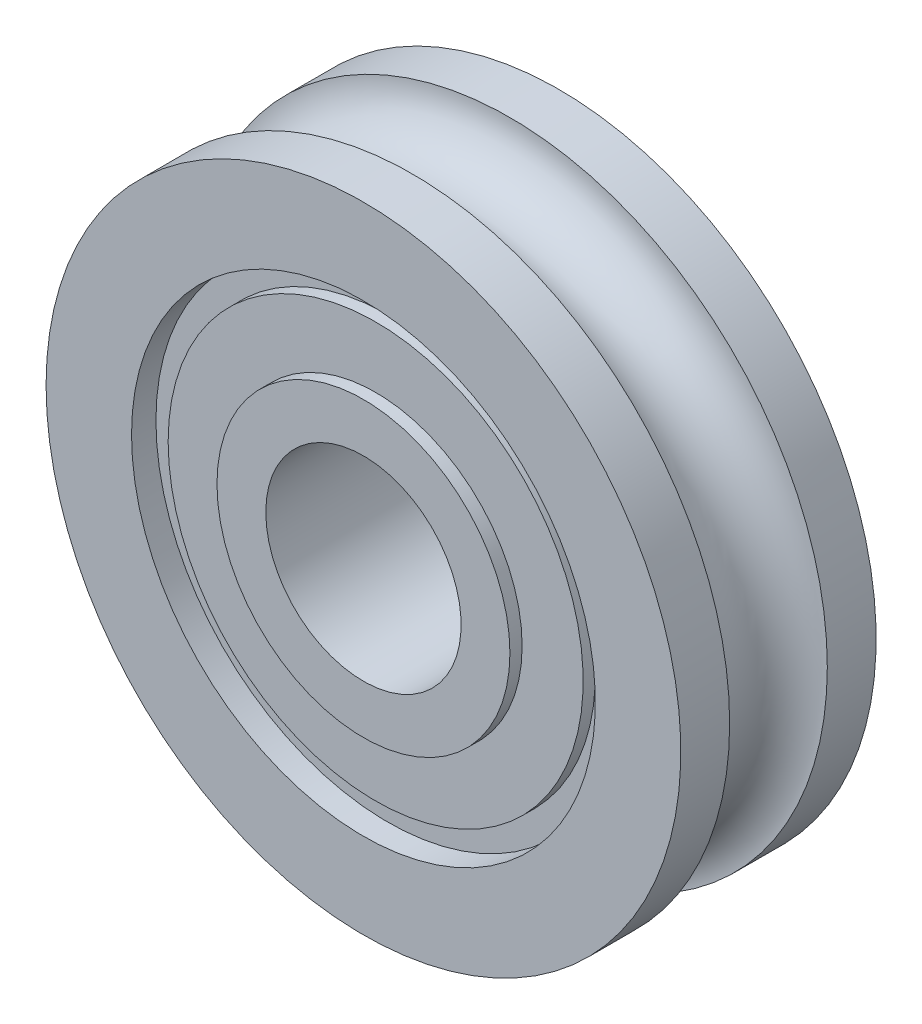
ISO-10303-21;
HEADER;
FILE_DESCRIPTION(('STEP AP214'),'2;1');
FILE_NAME('part.step','',(''),(''),'','','');
FILE_SCHEMA(('AUTOMOTIVE_DESIGN { 1 0 10303 214 1 1 1 1 }'));
ENDSEC;
DATA;
#1=APPLICATION_CONTEXT('core data for automotive mechanical design processes');
#2=APPLICATION_PROTOCOL_DEFINITION('international standard','automotive_design',2000,#1);
#3=PRODUCT_CONTEXT('',#1,'mechanical');
#4=PRODUCT('Part','Part','',(#3));
#5=PRODUCT_RELATED_PRODUCT_CATEGORY('part','',(#4));
#6=PRODUCT_DEFINITION_FORMATION('','',#4);
#7=PRODUCT_DEFINITION_CONTEXT('part definition',#1,'design');
#8=PRODUCT_DEFINITION('design','',#6,#7);
#9=PRODUCT_DEFINITION_SHAPE('','',#8);
#10=(LENGTH_UNIT() NAMED_UNIT(*) SI_UNIT(.MILLI.,.METRE.));
#11=(NAMED_UNIT(*) PLANE_ANGLE_UNIT() SI_UNIT($,.RADIAN.));
#12=(NAMED_UNIT(*) SI_UNIT($,.STERADIAN.) SOLID_ANGLE_UNIT());
#13=UNCERTAINTY_MEASURE_WITH_UNIT(LENGTH_MEASURE(1.E-05),#10,'distance_accuracy_value','');
#14=(GEOMETRIC_REPRESENTATION_CONTEXT(3) GLOBAL_UNCERTAINTY_ASSIGNED_CONTEXT((#13)) GLOBAL_UNIT_ASSIGNED_CONTEXT((#10,
#11,#12)) REPRESENTATION_CONTEXT('',''));
#15=CARTESIAN_POINT('',(0.,0.,0.));
#16=DIRECTION('',(0.,0.,1.));
#17=DIRECTION('',(1.,0.,0.));
#18=AXIS2_PLACEMENT_3D('',#15,#16,#17);
#19=CARTESIAN_POINT('',(0.,0.,2.));
#20=DIRECTION('',(0.,0.,1.));
#21=DIRECTION('',(1.,0.,0.));
#22=AXIS2_PLACEMENT_3D('',#19,#20,#21);
#23=PLANE('',#22);
#24=CARTESIAN_POINT('',(0.,0.,2.));
#25=DIRECTION('',(0.,0.,-1.));
#26=DIRECTION('',(1.,0.,0.));
#27=AXIS2_PLACEMENT_3D('',#24,#25,#26);
#28=CIRCLE('',#27,4.75);
#29=CARTESIAN_POINT('',(-4.75,0.,2.));
#30=VERTEX_POINT('',#29);
#31=EDGE_CURVE('E150',#30,#30,#28,.T.);
#32=ORIENTED_EDGE('',*,*,#31,.T.);
#33=EDGE_LOOP('',(#32));
#34=FACE_BOUND('',#33,.T.);
#35=CARTESIAN_POINT('',(0.,0.,2.));
#36=DIRECTION('',(0.,0.,1.));
#37=DIRECTION('',(1.,0.,0.));
#38=AXIS2_PLACEMENT_3D('',#35,#36,#37);
#39=CIRCLE('',#38,6.5);
#40=CARTESIAN_POINT('',(-6.5,0.,2.));
#41=VERTEX_POINT('',#40);
#42=EDGE_CURVE('E24',#41,#41,#39,.T.);
#43=ORIENTED_EDGE('',*,*,#42,.T.);
#44=EDGE_LOOP('',(#43));
#45=FACE_BOUND('',#44,.T.);
#46=ADVANCED_FACE('F16',(#34,#45),#23,.T.);
#47=CARTESIAN_POINT('',(0.,0.,0.));
#48=DIRECTION('',(0.,0.,1.));
#49=DIRECTION('',(1.,0.,0.));
#50=AXIS2_PLACEMENT_3D('',#47,#48,#49);
#51=CYLINDRICAL_SURFACE('',#50,6.5);
#52=ORIENTED_EDGE('',*,*,#42,.F.);
#53=DIRECTION('',(0.,0.,-1.));
#54=VECTOR('',#53,1.);
#55=CARTESIAN_POINT('',(-6.5,0.,0.));
#56=LINE('',#55,#54);
#57=CARTESIAN_POINT('',(-6.5,0.,1.));
#58=VERTEX_POINT('',#57);
#59=EDGE_CURVE('E11',#41,#58,#56,.T.);
#60=ORIENTED_EDGE('',*,*,#59,.T.);
#61=CARTESIAN_POINT('',(0.,0.,1.));
#62=DIRECTION('',(0.,0.,1.));
#63=DIRECTION('',(1.,0.,0.));
#64=AXIS2_PLACEMENT_3D('',#61,#62,#63);
#65=CIRCLE('',#64,6.5);
#66=CARTESIAN_POINT('',(6.5,0.,1.));
#67=VERTEX_POINT('',#66);
#68=EDGE_CURVE('E167',#58,#67,#65,.T.);
#69=ORIENTED_EDGE('',*,*,#68,.T.);
#70=CARTESIAN_POINT('',(0.,0.,1.));
#71=DIRECTION('',(0.,0.,1.));
#72=DIRECTION('',(1.,0.,0.));
#73=AXIS2_PLACEMENT_3D('',#70,#71,#72);
#74=CIRCLE('',#73,6.5);
#75=EDGE_CURVE('E169',#67,#58,#74,.T.);
#76=ORIENTED_EDGE('',*,*,#75,.T.);
#77=ORIENTED_EDGE('',*,*,#59,.F.);
#78=EDGE_LOOP('',(#52,#60,#69,#76,#77));
#79=FACE_BOUND('',#78,.T.);
#80=ADVANCED_FACE('F164',(#79),#51,.T.);
#81=CARTESIAN_POINT('',(0.,0.,0.));
#82=DIRECTION('',(0.,0.,1.));
#83=DIRECTION('',(1.,0.,0.));
#84=AXIS2_PLACEMENT_3D('',#81,#82,#83);
#85=CYLINDRICAL_SURFACE('',#84,4.75);
#86=CARTESIAN_POINT('',(0.,0.,-1.5));
#87=DIRECTION('',(0.,0.,1.));
#88=DIRECTION('',(1.,0.,0.));
#89=AXIS2_PLACEMENT_3D('',#86,#87,#88);
#90=CIRCLE('',#89,4.75);
#91=CARTESIAN_POINT('',(-4.75,0.,-1.5));
#92=VERTEX_POINT('',#91);
#93=EDGE_CURVE('E200',#92,#92,#90,.T.);
#94=ORIENTED_EDGE('',*,*,#93,.T.);
#95=DIRECTION('',(0.,0.,-1.));
#96=VECTOR('',#95,1.);
#97=CARTESIAN_POINT('',(-4.75,0.,0.));
#98=LINE('',#97,#96);
#99=CARTESIAN_POINT('',(-4.75,0.,-2.));
#100=VERTEX_POINT('',#99);
#101=EDGE_CURVE('E44',#92,#100,#98,.T.);
#102=ORIENTED_EDGE('',*,*,#101,.T.);
#103=CARTESIAN_POINT('',(0.,0.,-2.));
#104=DIRECTION('',(0.,0.,1.));
#105=DIRECTION('',(1.,0.,0.));
#106=AXIS2_PLACEMENT_3D('',#103,#104,#105);
#107=CIRCLE('',#106,4.75);
#108=EDGE_CURVE('E157',#100,#100,#107,.T.);
#109=ORIENTED_EDGE('',*,*,#108,.F.);
#110=ORIENTED_EDGE('',*,*,#101,.F.);
#111=EDGE_LOOP('',(#94,#102,#109,#110));
#112=FACE_BOUND('',#111,.T.);
#113=ADVANCED_FACE('F256',(#112),#85,.F.);
#114=CARTESIAN_POINT('',(0.,0.,-2.));
#115=DIRECTION('',(0.,0.,1.));
#116=DIRECTION('',(1.,0.,0.));
#117=AXIS2_PLACEMENT_3D('',#114,#115,#116);
#118=PLANE('',#117);
#119=ORIENTED_EDGE('',*,*,#108,.T.);
#120=EDGE_LOOP('',(#119));
#121=FACE_BOUND('',#120,.T.);
#122=CARTESIAN_POINT('',(0.,0.,-2.));
#123=DIRECTION('',(0.,0.,-1.));
#124=DIRECTION('',(1.,0.,0.));
#125=AXIS2_PLACEMENT_3D('',#122,#123,#124);
#126=CIRCLE('',#125,6.5);
#127=CARTESIAN_POINT('',(-6.5,0.,-2.));
#128=VERTEX_POINT('',#127);
#129=EDGE_CURVE('E198',#128,#128,#126,.T.);
#130=ORIENTED_EDGE('',*,*,#129,.T.);
#131=EDGE_LOOP('',(#130));
#132=FACE_BOUND('',#131,.T.);
#133=ADVANCED_FACE('F260',(#121,#132),#118,.F.);
#134=CARTESIAN_POINT('',(0.,0.,0.));
#135=DIRECTION('',(0.,0.,1.));
#136=DIRECTION('',(1.,0.,0.));
#137=AXIS2_PLACEMENT_3D('',#134,#135,#136);
#138=CYLINDRICAL_SURFACE('',#137,4.75);
#139=ORIENTED_EDGE('',*,*,#31,.F.);
#140=DIRECTION('',(0.,0.,-1.));
#141=VECTOR('',#140,1.);
#142=CARTESIAN_POINT('',(-4.75,0.,0.));
#143=LINE('',#142,#141);
#144=CARTESIAN_POINT('',(-4.75,0.,1.5));
#145=VERTEX_POINT('',#144);
#146=EDGE_CURVE('E154',#30,#145,#143,.T.);
#147=ORIENTED_EDGE('',*,*,#146,.T.);
#148=CARTESIAN_POINT('',(0.,0.,1.5));
#149=DIRECTION('',(0.,0.,-1.));
#150=DIRECTION('',(1.,0.,0.));
#151=AXIS2_PLACEMENT_3D('',#148,#149,#150);
#152=CIRCLE('',#151,4.75);
#153=EDGE_CURVE('E186',#145,#145,#152,.T.);
#154=ORIENTED_EDGE('',*,*,#153,.T.);
#155=ORIENTED_EDGE('',*,*,#146,.F.);
#156=EDGE_LOOP('',(#139,#147,#154,#155));
#157=FACE_BOUND('',#156,.T.);
#158=ADVANCED_FACE('F249',(#157),#138,.F.);
#159=CARTESIAN_POINT('',(0.,0.,2.));
#160=DIRECTION('',(0.,0.,1.));
#161=DIRECTION('',(1.,0.,0.));
#162=AXIS2_PLACEMENT_3D('',#159,#160,#161);
#163=PLANE('',#162);
#164=CARTESIAN_POINT('',(0.,0.,2.));
#165=DIRECTION('',(0.,0.,-1.));
#166=DIRECTION('',(1.,0.,0.));
#167=AXIS2_PLACEMENT_3D('',#164,#165,#166);
#168=CIRCLE('',#167,2.);
#169=CARTESIAN_POINT('',(-2.,0.,2.));
#170=VERTEX_POINT('',#169);
#171=EDGE_CURVE('E140',#170,#170,#168,.T.);
#172=ORIENTED_EDGE('',*,*,#171,.T.);
#173=EDGE_LOOP('',(#172));
#174=FACE_BOUND('',#173,.T.);
#175=CARTESIAN_POINT('',(0.,0.,2.));
#176=DIRECTION('',(0.,0.,1.));
#177=DIRECTION('',(1.,0.,0.));
#178=AXIS2_PLACEMENT_3D('',#175,#176,#177);
#179=CIRCLE('',#178,3.);
#180=CARTESIAN_POINT('',(-3.,0.,2.));
#181=VERTEX_POINT('',#180);
#182=EDGE_CURVE('E124',#181,#181,#179,.T.);
#183=ORIENTED_EDGE('',*,*,#182,.T.);
#184=EDGE_LOOP('',(#183));
#185=FACE_BOUND('',#184,.T.);
#186=ADVANCED_FACE('F268',(#174,#185),#163,.T.);
#187=CARTESIAN_POINT('',(0.,0.,0.));
#188=DIRECTION('',(0.,0.,1.));
#189=DIRECTION('',(1.,0.,0.));
#190=AXIS2_PLACEMENT_3D('',#187,#188,#189);
#191=CYLINDRICAL_SURFACE('',#190,3.);
#192=CARTESIAN_POINT('',(0.,0.,-1.75));
#193=DIRECTION('',(0.,0.,-1.));
#194=DIRECTION('',(1.,0.,0.));
#195=AXIS2_PLACEMENT_3D('',#192,#193,#194);
#196=CIRCLE('',#195,3.);
#197=CARTESIAN_POINT('',(-3.,0.,-1.75));
#198=VERTEX_POINT('',#197);
#199=EDGE_CURVE('E210',#198,#198,#196,.T.);
#200=ORIENTED_EDGE('',*,*,#199,.T.);
#201=DIRECTION('',(0.,0.,-1.));
#202=VECTOR('',#201,1.);
#203=CARTESIAN_POINT('',(-3.,0.,0.));
#204=LINE('',#203,#202);
#205=CARTESIAN_POINT('',(-3.,0.,-2.));
#206=VERTEX_POINT('',#205);
#207=EDGE_CURVE('E147',#198,#206,#204,.T.);
#208=ORIENTED_EDGE('',*,*,#207,.T.);
#209=CARTESIAN_POINT('',(0.,0.,-2.));
#210=DIRECTION('',(0.,0.,-1.));
#211=DIRECTION('',(1.,0.,0.));
#212=AXIS2_PLACEMENT_3D('',#209,#210,#211);
#213=CIRCLE('',#212,3.);
#214=EDGE_CURVE('E126',#206,#206,#213,.T.);
#215=ORIENTED_EDGE('',*,*,#214,.F.);
#216=ORIENTED_EDGE('',*,*,#207,.F.);
#217=EDGE_LOOP('',(#200,#208,#215,#216));
#218=FACE_BOUND('',#217,.T.);
#219=ADVANCED_FACE('F273',(#218),#191,.T.);
#220=CARTESIAN_POINT('',(0.,0.,0.));
#221=DIRECTION('',(0.,0.,1.));
#222=DIRECTION('',(1.,0.,0.));
#223=AXIS2_PLACEMENT_3D('',#220,#221,#222);
#224=CYLINDRICAL_SURFACE('',#223,2.);
#225=ORIENTED_EDGE('',*,*,#171,.F.);
#226=DIRECTION('',(0.,0.,-1.));
#227=VECTOR('',#226,1.);
#228=CARTESIAN_POINT('',(-2.,0.,0.));
#229=LINE('',#228,#227);
#230=CARTESIAN_POINT('',(-2.,0.,-2.));
#231=VERTEX_POINT('',#230);
#232=EDGE_CURVE('E144',#170,#231,#229,.T.);
#233=ORIENTED_EDGE('',*,*,#232,.T.);
#234=CARTESIAN_POINT('',(0.,0.,-2.));
#235=DIRECTION('',(0.,0.,1.));
#236=DIRECTION('',(1.,0.,0.));
#237=AXIS2_PLACEMENT_3D('',#234,#235,#236);
#238=CIRCLE('',#237,2.);
#239=EDGE_CURVE('E133',#231,#231,#238,.T.);
#240=ORIENTED_EDGE('',*,*,#239,.F.);
#241=ORIENTED_EDGE('',*,*,#232,.F.);
#242=EDGE_LOOP('',(#225,#233,#240,#241));
#243=FACE_BOUND('',#242,.T.);
#244=ADVANCED_FACE('F276',(#243),#224,.F.);
#245=CARTESIAN_POINT('',(0.,0.,-2.));
#246=DIRECTION('',(0.,0.,1.));
#247=DIRECTION('',(1.,0.,0.));
#248=AXIS2_PLACEMENT_3D('',#245,#246,#247);
#249=PLANE('',#248);
#250=ORIENTED_EDGE('',*,*,#239,.T.);
#251=EDGE_LOOP('',(#250));
#252=FACE_BOUND('',#251,.T.);
#253=ORIENTED_EDGE('',*,*,#214,.T.);
#254=EDGE_LOOP('',(#253));
#255=FACE_BOUND('',#254,.T.);
#256=ADVANCED_FACE('F283',(#252,#255),#249,.F.);
#257=CARTESIAN_POINT('',(0.,0.,0.));
#258=DIRECTION('',(0.,0.,1.));
#259=DIRECTION('',(1.,0.,0.));
#260=AXIS2_PLACEMENT_3D('',#257,#258,#259);
#261=CYLINDRICAL_SURFACE('',#260,3.);
#262=ORIENTED_EDGE('',*,*,#182,.F.);
#263=DIRECTION('',(0.,0.,-1.));
#264=VECTOR('',#263,1.);
#265=CARTESIAN_POINT('',(-3.,0.,0.));
#266=LINE('',#265,#264);
#267=CARTESIAN_POINT('',(-3.,0.,1.75));
#268=VERTEX_POINT('',#267);
#269=EDGE_CURVE('E119',#181,#268,#266,.T.);
#270=ORIENTED_EDGE('',*,*,#269,.T.);
#271=CARTESIAN_POINT('',(0.,0.,1.75));
#272=DIRECTION('',(0.,0.,1.));
#273=DIRECTION('',(1.,0.,0.));
#274=AXIS2_PLACEMENT_3D('',#271,#272,#273);
#275=CIRCLE('',#274,3.);
#276=EDGE_CURVE('E122',#268,#268,#275,.T.);
#277=ORIENTED_EDGE('',*,*,#276,.T.);
#278=ORIENTED_EDGE('',*,*,#269,.F.);
#279=EDGE_LOOP('',(#262,#270,#277,#278));
#280=FACE_BOUND('',#279,.T.);
#281=ADVANCED_FACE('F120',(#280),#261,.T.);
#282=CARTESIAN_POINT('',(0.,0.,1.75));
#283=DIRECTION('',(0.,0.,1.));
#284=DIRECTION('',(1.,0.,0.));
#285=AXIS2_PLACEMENT_3D('',#282,#283,#284);
#286=PLANE('',#285);
#287=ORIENTED_EDGE('',*,*,#276,.F.);
#288=EDGE_LOOP('',(#287));
#289=FACE_BOUND('',#288,.T.);
#290=CARTESIAN_POINT('',(0.,0.,1.75));
#291=DIRECTION('',(0.,0.,1.));
#292=DIRECTION('',(1.,0.,0.));
#293=AXIS2_PLACEMENT_3D('',#290,#291,#292);
#294=CIRCLE('',#293,4.25);
#295=CARTESIAN_POINT('',(-4.25,0.,1.75));
#296=VERTEX_POINT('',#295);
#297=EDGE_CURVE('E195',#296,#296,#294,.T.);
#298=ORIENTED_EDGE('',*,*,#297,.T.);
#299=EDGE_LOOP('',(#298));
#300=FACE_BOUND('',#299,.T.);
#301=ADVANCED_FACE('F236',(#289,#300),#286,.T.);
#302=CARTESIAN_POINT('',(0.,0.,0.));
#303=DIRECTION('',(0.,0.,1.));
#304=DIRECTION('',(1.,0.,0.));
#305=AXIS2_PLACEMENT_3D('',#302,#303,#304);
#306=CYLINDRICAL_SURFACE('',#305,4.25);
#307=CARTESIAN_POINT('',(0.,0.,-1.5));
#308=DIRECTION('',(0.,0.,-1.));
#309=DIRECTION('',(1.,0.,0.));
#310=AXIS2_PLACEMENT_3D('',#307,#308,#309);
#311=CIRCLE('',#310,4.25);
#312=CARTESIAN_POINT('',(-4.25,0.,-1.5));
#313=VERTEX_POINT('',#312);
#314=EDGE_CURVE('E191',#313,#313,#311,.T.);
#315=ORIENTED_EDGE('',*,*,#314,.T.);
#316=DIRECTION('',(0.,0.,-1.));
#317=VECTOR('',#316,1.);
#318=CARTESIAN_POINT('',(-4.25,0.,0.));
#319=LINE('',#318,#317);
#320=CARTESIAN_POINT('',(-4.25,0.,-1.75));
#321=VERTEX_POINT('',#320);
#322=EDGE_CURVE('E213',#313,#321,#319,.T.);
#323=ORIENTED_EDGE('',*,*,#322,.T.);
#324=CARTESIAN_POINT('',(0.,0.,-1.75));
#325=DIRECTION('',(0.,0.,-1.));
#326=DIRECTION('',(1.,0.,0.));
#327=AXIS2_PLACEMENT_3D('',#324,#325,#326);
#328=CIRCLE('',#327,4.25);
#329=EDGE_CURVE('E206',#321,#321,#328,.T.);
#330=ORIENTED_EDGE('',*,*,#329,.F.);
#331=ORIENTED_EDGE('',*,*,#322,.F.);
#332=EDGE_LOOP('',(#315,#323,#330,#331));
#333=FACE_BOUND('',#332,.T.);
#334=ADVANCED_FACE('F271',(#333),#306,.T.);
#335=CARTESIAN_POINT('',(0.,0.,-1.75));
#336=DIRECTION('',(0.,0.,1.));
#337=DIRECTION('',(1.,0.,0.));
#338=AXIS2_PLACEMENT_3D('',#335,#336,#337);
#339=PLANE('',#338);
#340=ORIENTED_EDGE('',*,*,#199,.F.);
#341=EDGE_LOOP('',(#340));
#342=FACE_BOUND('',#341,.T.);
#343=ORIENTED_EDGE('',*,*,#329,.T.);
#344=EDGE_LOOP('',(#343));
#345=FACE_BOUND('',#344,.T.);
#346=ADVANCED_FACE('F280',(#342,#345),#339,.F.);
#347=CARTESIAN_POINT('',(0.,0.,0.));
#348=DIRECTION('',(0.,0.,1.));
#349=DIRECTION('',(1.,0.,0.));
#350=AXIS2_PLACEMENT_3D('',#347,#348,#349);
#351=CYLINDRICAL_SURFACE('',#350,4.25);
#352=ORIENTED_EDGE('',*,*,#297,.F.);
#353=DIRECTION('',(0.,0.,-1.));
#354=VECTOR('',#353,1.);
#355=CARTESIAN_POINT('',(-4.25,0.,0.));
#356=LINE('',#355,#354);
#357=CARTESIAN_POINT('',(-4.25,0.,1.5));
#358=VERTEX_POINT('',#357);
#359=EDGE_CURVE('E203',#296,#358,#356,.T.);
#360=ORIENTED_EDGE('',*,*,#359,.T.);
#361=CARTESIAN_POINT('',(0.,0.,1.5));
#362=DIRECTION('',(0.,0.,1.));
#363=DIRECTION('',(1.,0.,0.));
#364=AXIS2_PLACEMENT_3D('',#361,#362,#363);
#365=CIRCLE('',#364,4.25);
#366=EDGE_CURVE('E190',#358,#358,#365,.T.);
#367=ORIENTED_EDGE('',*,*,#366,.T.);
#368=ORIENTED_EDGE('',*,*,#359,.F.);
#369=EDGE_LOOP('',(#352,#360,#367,#368));
#370=FACE_BOUND('',#369,.T.);
#371=ADVANCED_FACE('F238',(#370),#351,.T.);
#372=CARTESIAN_POINT('',(0.,0.,1.5));
#373=DIRECTION('',(0.,0.,1.));
#374=DIRECTION('',(1.,0.,0.));
#375=AXIS2_PLACEMENT_3D('',#372,#373,#374);
#376=PLANE('',#375);
#377=ORIENTED_EDGE('',*,*,#366,.F.);
#378=EDGE_LOOP('',(#377));
#379=FACE_BOUND('',#378,.T.);
#380=ORIENTED_EDGE('',*,*,#153,.F.);
#381=EDGE_LOOP('',(#380));
#382=FACE_BOUND('',#381,.T.);
#383=ADVANCED_FACE('F241',(#379,#382),#376,.T.);
#384=CARTESIAN_POINT('',(0.,0.,-1.5));
#385=DIRECTION('',(0.,0.,1.));
#386=DIRECTION('',(1.,0.,0.));
#387=AXIS2_PLACEMENT_3D('',#384,#385,#386);
#388=PLANE('',#387);
#389=ORIENTED_EDGE('',*,*,#314,.F.);
#390=EDGE_LOOP('',(#389));
#391=FACE_BOUND('',#390,.T.);
#392=ORIENTED_EDGE('',*,*,#93,.F.);
#393=EDGE_LOOP('',(#392));
#394=FACE_BOUND('',#393,.T.);
#395=ADVANCED_FACE('F244',(#391,#394),#388,.F.);
#396=CARTESIAN_POINT('',(0.,0.,0.));
#397=DIRECTION('',(0.,0.,1.));
#398=DIRECTION('',(1.,0.,0.));
#399=AXIS2_PLACEMENT_3D('',#396,#397,#398);
#400=CYLINDRICAL_SURFACE('',#399,6.5);
#401=CARTESIAN_POINT('',(0.,0.,-1.));
#402=DIRECTION('',(0.,0.,-1.));
#403=DIRECTION('',(1.,0.,0.));
#404=AXIS2_PLACEMENT_3D('',#401,#402,#403);
#405=CIRCLE('',#404,6.5);
#406=CARTESIAN_POINT('',(-6.5,0.,-1.));
#407=VERTEX_POINT('',#406);
#408=CARTESIAN_POINT('',(6.5,0.,-1.));
#409=VERTEX_POINT('',#408);
#410=EDGE_CURVE('E226',#407,#409,#405,.T.);
#411=ORIENTED_EDGE('',*,*,#410,.T.);
#412=CARTESIAN_POINT('',(0.,0.,-1.));
#413=DIRECTION('',(0.,0.,-1.));
#414=DIRECTION('',(1.,0.,0.));
#415=AXIS2_PLACEMENT_3D('',#412,#413,#414);
#416=CIRCLE('',#415,6.5);
#417=EDGE_CURVE('E182',#409,#407,#416,.T.);
#418=ORIENTED_EDGE('',*,*,#417,.T.);
#419=DIRECTION('',(0.,0.,-1.));
#420=VECTOR('',#419,1.);
#421=CARTESIAN_POINT('',(-6.5,0.,0.));
#422=LINE('',#421,#420);
#423=EDGE_CURVE('E172',#407,#128,#422,.T.);
#424=ORIENTED_EDGE('',*,*,#423,.T.);
#425=ORIENTED_EDGE('',*,*,#129,.F.);
#426=ORIENTED_EDGE('',*,*,#423,.F.);
#427=EDGE_LOOP('',(#411,#418,#424,#425,#426));
#428=FACE_BOUND('',#427,.T.);
#429=ADVANCED_FACE('F291',(#428),#400,.T.);
#430=CARTESIAN_POINT('',(0.,0.,0.));
#431=DIRECTION('',(0.,0.,-1.));
#432=DIRECTION('',(-1.,0.,0.));
#433=AXIS2_PLACEMENT_3D('',#430,#431,#432);
#434=TOROIDAL_SURFACE('',#433,6.5,1.);
#435=ORIENTED_EDGE('',*,*,#410,.F.);
#436=ORIENTED_EDGE('',*,*,#417,.F.);
#437=CARTESIAN_POINT('',(6.5,0.,0.));
#438=DIRECTION('',(0.,1.,0.));
#439=DIRECTION('',(1.,0.,0.));
#440=AXIS2_PLACEMENT_3D('',#437,#438,#439);
#441=CIRCLE('',#440,1.);
#442=EDGE_CURVE('E177',#409,#67,#441,.T.);
#443=ORIENTED_EDGE('',*,*,#442,.T.);
#444=ORIENTED_EDGE('',*,*,#68,.F.);
#445=ORIENTED_EDGE('',*,*,#75,.F.);
#446=ORIENTED_EDGE('',*,*,#442,.F.);
#447=EDGE_LOOP('',(#435,#436,#443,#444,#445,#446));
#448=FACE_BOUND('',#447,.T.);
#449=ADVANCED_FACE('F175',(#448),#434,.F.);
#450=CLOSED_SHELL('',(#46,#80,#113,#133,#158,#186,#219,#244,#256,#281,#301,#334,#346,#371,#383,
#395,#429,#449));
#451=MANIFOLD_SOLID_BREP('B1',#450);
#452=ADVANCED_BREP_SHAPE_REPRESENTATION('',(#18,#451),#14);
#453=SHAPE_DEFINITION_REPRESENTATION(#9,#452);
ENDSEC;
END-ISO-10303-21;
